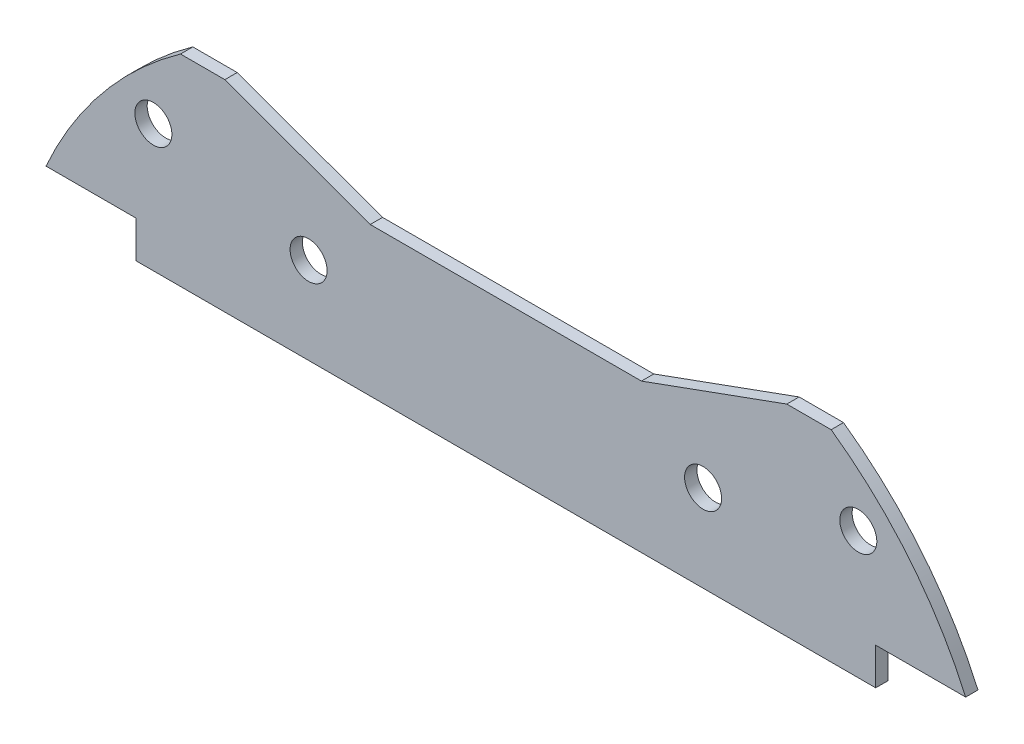
ISO-10303-21;
HEADER;
FILE_DESCRIPTION(('STEP AP214'),'2;1');
FILE_NAME('part.step','',(''),(''),'','','');
FILE_SCHEMA(('AUTOMOTIVE_DESIGN { 1 0 10303 214 1 1 1 1 }'));
ENDSEC;
DATA;
#1=APPLICATION_CONTEXT('core data for automotive mechanical design processes');
#2=APPLICATION_PROTOCOL_DEFINITION('international standard','automotive_design',2000,#1);
#3=PRODUCT_CONTEXT('',#1,'mechanical');
#4=PRODUCT('Part','Part','',(#3));
#5=PRODUCT_RELATED_PRODUCT_CATEGORY('part','',(#4));
#6=PRODUCT_DEFINITION_FORMATION('','',#4);
#7=PRODUCT_DEFINITION_CONTEXT('part definition',#1,'design');
#8=PRODUCT_DEFINITION('design','',#6,#7);
#9=PRODUCT_DEFINITION_SHAPE('','',#8);
#10=(LENGTH_UNIT() NAMED_UNIT(*) SI_UNIT(.MILLI.,.METRE.));
#11=(NAMED_UNIT(*) PLANE_ANGLE_UNIT() SI_UNIT($,.RADIAN.));
#12=(NAMED_UNIT(*) SI_UNIT($,.STERADIAN.) SOLID_ANGLE_UNIT());
#13=UNCERTAINTY_MEASURE_WITH_UNIT(LENGTH_MEASURE(1.E-05),#10,'distance_accuracy_value','');
#14=(GEOMETRIC_REPRESENTATION_CONTEXT(3) GLOBAL_UNCERTAINTY_ASSIGNED_CONTEXT((#13)) GLOBAL_UNIT_ASSIGNED_CONTEXT((#10,
#11,#12)) REPRESENTATION_CONTEXT('',''));
#15=CARTESIAN_POINT('',(0.,0.,0.));
#16=DIRECTION('',(0.,0.,1.));
#17=DIRECTION('',(1.,0.,0.));
#18=AXIS2_PLACEMENT_3D('',#15,#16,#17);
#19=CARTESIAN_POINT('',(0.,0.,0.));
#20=DIRECTION('',(0.,0.,1.));
#21=DIRECTION('',(1.,0.,0.));
#22=AXIS2_PLACEMENT_3D('',#19,#20,#21);
#23=PLANE('',#22);
#24=CARTESIAN_POINT('',(16.,20.5,0.));
#25=DIRECTION('',(0.,0.,-1.));
#26=DIRECTION('',(-1.,0.,0.));
#27=AXIS2_PLACEMENT_3D('',#24,#25,#26);
#28=CIRCLE('',#27,1.5);
#29=CARTESIAN_POINT('',(14.5,20.5,0.));
#30=VERTEX_POINT('',#29);
#31=EDGE_CURVE('E178',#30,#30,#28,.T.);
#32=ORIENTED_EDGE('',*,*,#31,.F.);
#33=EDGE_LOOP('',(#32));
#34=FACE_BOUND('',#33,.T.);
#35=CARTESIAN_POINT('',(-16.,20.5,0.));
#36=DIRECTION('',(0.,0.,-1.));
#37=DIRECTION('',(1.,0.,0.));
#38=AXIS2_PLACEMENT_3D('',#35,#36,#37);
#39=CIRCLE('',#38,1.5);
#40=CARTESIAN_POINT('',(-14.5,20.5,0.));
#41=VERTEX_POINT('',#40);
#42=EDGE_CURVE('E184',#41,#41,#39,.T.);
#43=ORIENTED_EDGE('',*,*,#42,.F.);
#44=EDGE_LOOP('',(#43));
#45=FACE_BOUND('',#44,.T.);
#46=CARTESIAN_POINT('',(-28.5900387108147,23.7802641955972,0.));
#47=DIRECTION('',(0.,0.,1.));
#48=DIRECTION('',(1.,0.,0.));
#49=AXIS2_PLACEMENT_3D('',#46,#47,#48);
#50=CIRCLE('',#49,1.5);
#51=CARTESIAN_POINT('',(-27.0900387108147,23.7802641955972,0.));
#52=VERTEX_POINT('',#51);
#53=EDGE_CURVE('E145',#52,#52,#50,.T.);
#54=ORIENTED_EDGE('',*,*,#53,.T.);
#55=EDGE_LOOP('',(#54));
#56=FACE_BOUND('',#55,.T.);
#57=CARTESIAN_POINT('',(28.5900387108147,23.7802641955972,0.));
#58=DIRECTION('',(0.,0.,1.));
#59=DIRECTION('',(-1.,0.,0.));
#60=AXIS2_PLACEMENT_3D('',#57,#58,#59);
#61=CIRCLE('',#60,1.5);
#62=CARTESIAN_POINT('',(27.0900387108147,23.7802641955972,0.));
#63=VERTEX_POINT('',#62);
#64=EDGE_CURVE('E196',#63,#63,#61,.T.);
#65=ORIENTED_EDGE('',*,*,#64,.T.);
#66=EDGE_LOOP('',(#65));
#67=FACE_BOUND('',#66,.T.);
#68=DIRECTION('',(0.,-1.,0.));
#69=VECTOR('',#68,1.);
#70=CARTESIAN_POINT('',(30.,16.4492983568228,0.));
#71=LINE('',#70,#69);
#72=CARTESIAN_POINT('',(30.,16.4492983568228,0.));
#73=VERTEX_POINT('',#72);
#74=CARTESIAN_POINT('',(30.,13.4492983568228,0.));
#75=VERTEX_POINT('',#74);
#76=EDGE_CURVE('E144',#73,#75,#71,.T.);
#77=ORIENTED_EDGE('',*,*,#76,.T.);
#78=DIRECTION('',(-1.,0.,0.));
#79=VECTOR('',#78,1.);
#80=CARTESIAN_POINT('',(-30.,13.4492983568228,0.));
#81=LINE('',#80,#79);
#82=CARTESIAN_POINT('',(-30.,13.4492983568228,0.));
#83=VERTEX_POINT('',#82);
#84=EDGE_CURVE('E129',#75,#83,#81,.T.);
#85=ORIENTED_EDGE('',*,*,#84,.T.);
#86=DIRECTION('',(0.,1.,0.));
#87=VECTOR('',#86,1.);
#88=CARTESIAN_POINT('',(-30.,16.4492983568228,0.));
#89=LINE('',#88,#87);
#90=CARTESIAN_POINT('',(-30.,16.4492983568228,0.));
#91=VERTEX_POINT('',#90);
#92=EDGE_CURVE('E141',#83,#91,#89,.T.);
#93=ORIENTED_EDGE('',*,*,#92,.T.);
#94=DIRECTION('',(-1.,0.,0.));
#95=VECTOR('',#94,1.);
#96=CARTESIAN_POINT('',(0.,16.4492983568228,0.));
#97=LINE('',#96,#95);
#98=CARTESIAN_POINT('',(-37.299711921146,16.4492983568228,0.));
#99=VERTEX_POINT('',#98);
#100=EDGE_CURVE('E164',#91,#99,#97,.T.);
#101=ORIENTED_EDGE('',*,*,#100,.T.);
#102=CARTESIAN_POINT('',(-7.61252759266184,3.28373542568487,0.));
#103=DIRECTION('',(0.,0.,1.));
#104=DIRECTION('',(-1.,0.,0.));
#105=AXIS2_PLACEMENT_3D('',#102,#103,#104);
#106=CIRCLE('',#105,32.4755440392789);
#107=CARTESIAN_POINT('',(-26.3900387108147,29.7802641955972,0.));
#108=VERTEX_POINT('',#107);
#109=EDGE_CURVE('E239',#108,#99,#106,.T.);
#110=ORIENTED_EDGE('',*,*,#109,.F.);
#111=DIRECTION('',(-1.,0.,0.));
#112=VECTOR('',#111,1.);
#113=CARTESIAN_POINT('',(-22.7900387108147,29.7802641955972,0.));
#114=LINE('',#113,#112);
#115=CARTESIAN_POINT('',(-22.7900387108147,29.7802641955972,0.));
#116=VERTEX_POINT('',#115);
#117=EDGE_CURVE('E234',#116,#108,#114,.T.);
#118=ORIENTED_EDGE('',*,*,#117,.F.);
#119=DIRECTION('',(-0.939973110395639,0.341248519019714,0.));
#120=VECTOR('',#119,1.);
#121=CARTESIAN_POINT('',(6.89853694287745,19.0021021805552,0.));
#122=LINE('',#121,#120);
#123=CARTESIAN_POINT('',(-11.,25.5,0.));
#124=VERTEX_POINT('',#123);
#125=EDGE_CURVE('E166',#124,#116,#122,.T.);
#126=ORIENTED_EDGE('',*,*,#125,.F.);
#127=DIRECTION('',(-1.,0.,0.));
#128=VECTOR('',#127,1.);
#129=CARTESIAN_POINT('',(0.,25.5,0.));
#130=LINE('',#129,#128);
#131=CARTESIAN_POINT('',(11.,25.5,0.));
#132=VERTEX_POINT('',#131);
#133=EDGE_CURVE('E171',#132,#124,#130,.T.);
#134=ORIENTED_EDGE('',*,*,#133,.F.);
#135=DIRECTION('',(0.939973110395639,0.341248519019713,0.));
#136=VECTOR('',#135,1.);
#137=CARTESIAN_POINT('',(-6.89853694287744,19.0021021805552,0.));
#138=LINE('',#137,#136);
#139=CARTESIAN_POINT('',(22.7900387108147,29.7802641955972,0.));
#140=VERTEX_POINT('',#139);
#141=EDGE_CURVE('E168',#132,#140,#138,.T.);
#142=ORIENTED_EDGE('',*,*,#141,.T.);
#143=DIRECTION('',(-1.,0.,0.));
#144=VECTOR('',#143,1.);
#145=CARTESIAN_POINT('',(22.7900387108147,29.7802641955972,0.));
#146=LINE('',#145,#144);
#147=CARTESIAN_POINT('',(26.3900387108147,29.7802641955972,0.));
#148=VERTEX_POINT('',#147);
#149=EDGE_CURVE('E227',#148,#140,#146,.T.);
#150=ORIENTED_EDGE('',*,*,#149,.F.);
#151=CARTESIAN_POINT('',(7.61252759266184,3.28373542568486,0.));
#152=DIRECTION('',(0.,0.,1.));
#153=DIRECTION('',(1.,0.,0.));
#154=AXIS2_PLACEMENT_3D('',#151,#152,#153);
#155=CIRCLE('',#154,32.4755440392789);
#156=CARTESIAN_POINT('',(37.299711921146,16.4492983568228,0.));
#157=VERTEX_POINT('',#156);
#158=EDGE_CURVE('E224',#157,#148,#155,.T.);
#159=ORIENTED_EDGE('',*,*,#158,.F.);
#160=DIRECTION('',(1.,0.,0.));
#161=VECTOR('',#160,1.);
#162=CARTESIAN_POINT('',(0.,16.4492983568228,0.));
#163=LINE('',#162,#161);
#164=EDGE_CURVE('E153',#73,#157,#163,.T.);
#165=ORIENTED_EDGE('',*,*,#164,.F.);
#166=EDGE_LOOP('',(#77,#85,#93,#101,#110,#118,#126,#134,#142,#150,#159,#165));
#167=FACE_BOUND('',#166,.T.);
#168=ADVANCED_FACE('F35',(#34,#45,#56,#67,#167),#23,.F.);
#169=CARTESIAN_POINT('',(6.89853694287745,19.0021021805552,3.));
#170=DIRECTION('',(-0.341248519019714,-0.939973110395639,0.));
#171=DIRECTION('',(0.939973110395639,-0.341248519019714,0.));
#172=AXIS2_PLACEMENT_3D('',#169,#170,#171);
#173=PLANE('',#172);
#174=DIRECTION('',(0.,0.,-1.));
#175=VECTOR('',#174,1.);
#176=CARTESIAN_POINT('',(-22.7900387108147,29.7802641955972,3.));
#177=LINE('',#176,#175);
#178=CARTESIAN_POINT('',(-22.7900387108147,29.7802641955972,1.));
#179=VERTEX_POINT('',#178);
#180=EDGE_CURVE('E11',#179,#116,#177,.T.);
#181=ORIENTED_EDGE('',*,*,#180,.F.);
#182=DIRECTION('',(-0.939973110395639,0.341248519019714,0.));
#183=VECTOR('',#182,1.);
#184=CARTESIAN_POINT('',(-22.7900387108147,29.7802641955972,1.));
#185=LINE('',#184,#183);
#186=CARTESIAN_POINT('',(-11.,25.5,1.));
#187=VERTEX_POINT('',#186);
#188=EDGE_CURVE('E218',#187,#179,#185,.T.);
#189=ORIENTED_EDGE('',*,*,#188,.F.);
#190=DIRECTION('',(0.,0.,-1.));
#191=VECTOR('',#190,1.);
#192=CARTESIAN_POINT('',(-11.,25.5,3.));
#193=LINE('',#192,#191);
#194=EDGE_CURVE('E60',#187,#124,#193,.T.);
#195=ORIENTED_EDGE('',*,*,#194,.T.);
#196=ORIENTED_EDGE('',*,*,#125,.T.);
#197=EDGE_LOOP('',(#181,#189,#195,#196));
#198=FACE_BOUND('',#197,.T.);
#199=ADVANCED_FACE('F37',(#198),#173,.F.);
#200=CARTESIAN_POINT('',(-6.89853694287744,19.0021021805552,3.));
#201=DIRECTION('',(-0.341248519019714,0.939973110395639,0.));
#202=DIRECTION('',(-0.939973110395639,-0.341248519019714,0.));
#203=AXIS2_PLACEMENT_3D('',#200,#201,#202);
#204=PLANE('',#203);
#205=DIRECTION('',(-0.939973110395639,-0.341248519019713,0.));
#206=VECTOR('',#205,1.);
#207=CARTESIAN_POINT('',(11.,25.5,1.));
#208=LINE('',#207,#206);
#209=CARTESIAN_POINT('',(22.7900387108147,29.7802641955972,1.));
#210=VERTEX_POINT('',#209);
#211=CARTESIAN_POINT('',(11.,25.5,1.));
#212=VERTEX_POINT('',#211);
#213=EDGE_CURVE('E214',#210,#212,#208,.T.);
#214=ORIENTED_EDGE('',*,*,#213,.F.);
#215=DIRECTION('',(0.,0.,-1.));
#216=VECTOR('',#215,1.);
#217=CARTESIAN_POINT('',(22.7900387108147,29.7802641955972,3.));
#218=LINE('',#217,#216);
#219=EDGE_CURVE('E44',#210,#140,#218,.T.);
#220=ORIENTED_EDGE('',*,*,#219,.T.);
#221=ORIENTED_EDGE('',*,*,#141,.F.);
#222=DIRECTION('',(0.,0.,-1.));
#223=VECTOR('',#222,1.);
#224=CARTESIAN_POINT('',(11.,25.5,3.));
#225=LINE('',#224,#223);
#226=EDGE_CURVE('E174',#212,#132,#225,.T.);
#227=ORIENTED_EDGE('',*,*,#226,.F.);
#228=EDGE_LOOP('',(#214,#220,#221,#227));
#229=FACE_BOUND('',#228,.T.);
#230=ADVANCED_FACE('F267',(#229),#204,.T.);
#231=CARTESIAN_POINT('',(0.,25.5,3.));
#232=DIRECTION('',(0.,-1.,0.));
#233=DIRECTION('',(1.,0.,0.));
#234=AXIS2_PLACEMENT_3D('',#231,#232,#233);
#235=PLANE('',#234);
#236=ORIENTED_EDGE('',*,*,#194,.F.);
#237=DIRECTION('',(-1.,0.,0.));
#238=VECTOR('',#237,1.);
#239=CARTESIAN_POINT('',(-11.,25.5,1.));
#240=LINE('',#239,#238);
#241=EDGE_CURVE('E216',#212,#187,#240,.T.);
#242=ORIENTED_EDGE('',*,*,#241,.F.);
#243=ORIENTED_EDGE('',*,*,#226,.T.);
#244=ORIENTED_EDGE('',*,*,#133,.T.);
#245=EDGE_LOOP('',(#236,#242,#243,#244));
#246=FACE_BOUND('',#245,.T.);
#247=ADVANCED_FACE('F260',(#246),#235,.F.);
#248=CARTESIAN_POINT('',(0.,16.4492983568228,0.));
#249=DIRECTION('',(0.,1.,0.));
#250=DIRECTION('',(0.,0.,1.));
#251=AXIS2_PLACEMENT_3D('',#248,#249,#250);
#252=PLANE('',#251);
#253=DIRECTION('',(0.,0.,1.));
#254=VECTOR('',#253,1.);
#255=CARTESIAN_POINT('',(-30.,16.4492983568228,0.));
#256=LINE('',#255,#254);
#257=CARTESIAN_POINT('',(-30.,16.4492983568228,1.));
#258=VERTEX_POINT('',#257);
#259=EDGE_CURVE('E150',#91,#258,#256,.T.);
#260=ORIENTED_EDGE('',*,*,#259,.T.);
#261=DIRECTION('',(1.,0.,0.));
#262=VECTOR('',#261,1.);
#263=CARTESIAN_POINT('',(-30.,16.4492983568228,1.));
#264=LINE('',#263,#262);
#265=CARTESIAN_POINT('',(-37.299711921146,16.4492983568228,1.));
#266=VERTEX_POINT('',#265);
#267=EDGE_CURVE('E201',#266,#258,#264,.T.);
#268=ORIENTED_EDGE('',*,*,#267,.F.);
#269=DIRECTION('',(0.,0.,1.));
#270=VECTOR('',#269,1.);
#271=CARTESIAN_POINT('',(-37.299711921146,16.4492983568228,0.));
#272=LINE('',#271,#270);
#273=EDGE_CURVE('E161',#99,#266,#272,.T.);
#274=ORIENTED_EDGE('',*,*,#273,.F.);
#275=ORIENTED_EDGE('',*,*,#100,.F.);
#276=EDGE_LOOP('',(#260,#268,#274,#275));
#277=FACE_BOUND('',#276,.T.);
#278=ADVANCED_FACE('F256',(#277),#252,.F.);
#279=CARTESIAN_POINT('',(0.,16.4492983568228,0.));
#280=DIRECTION('',(0.,-1.,0.));
#281=DIRECTION('',(0.,0.,-1.));
#282=AXIS2_PLACEMENT_3D('',#279,#280,#281);
#283=PLANE('',#282);
#284=DIRECTION('',(1.,0.,0.));
#285=VECTOR('',#284,1.);
#286=CARTESIAN_POINT('',(30.,16.4492983568228,1.));
#287=LINE('',#286,#285);
#288=CARTESIAN_POINT('',(30.,16.4492983568228,1.));
#289=VERTEX_POINT('',#288);
#290=CARTESIAN_POINT('',(37.299711921146,16.4492983568228,1.));
#291=VERTEX_POINT('',#290);
#292=EDGE_CURVE('E52',#289,#291,#287,.T.);
#293=ORIENTED_EDGE('',*,*,#292,.F.);
#294=DIRECTION('',(0.,0.,1.));
#295=VECTOR('',#294,1.);
#296=CARTESIAN_POINT('',(30.,16.4492983568228,0.));
#297=LINE('',#296,#295);
#298=EDGE_CURVE('E151',#73,#289,#297,.T.);
#299=ORIENTED_EDGE('',*,*,#298,.F.);
#300=ORIENTED_EDGE('',*,*,#164,.T.);
#301=DIRECTION('',(0.,0.,1.));
#302=VECTOR('',#301,1.);
#303=CARTESIAN_POINT('',(37.299711921146,16.4492983568228,0.));
#304=LINE('',#303,#302);
#305=EDGE_CURVE('E230',#157,#291,#304,.T.);
#306=ORIENTED_EDGE('',*,*,#305,.T.);
#307=EDGE_LOOP('',(#293,#299,#300,#306));
#308=FACE_BOUND('',#307,.T.);
#309=ADVANCED_FACE('F278',(#308),#283,.T.);
#310=CARTESIAN_POINT('',(-30.,16.4492983568228,0.));
#311=DIRECTION('',(1.,0.,0.));
#312=DIRECTION('',(0.,1.,0.));
#313=AXIS2_PLACEMENT_3D('',#310,#311,#312);
#314=PLANE('',#313);
#315=ORIENTED_EDGE('',*,*,#92,.F.);
#316=DIRECTION('',(0.,0.,1.));
#317=VECTOR('',#316,1.);
#318=CARTESIAN_POINT('',(-30.,13.4492983568228,0.));
#319=LINE('',#318,#317);
#320=CARTESIAN_POINT('',(-30.,13.4492983568228,1.));
#321=VERTEX_POINT('',#320);
#322=EDGE_CURVE('E126',#83,#321,#319,.T.);
#323=ORIENTED_EDGE('',*,*,#322,.T.);
#324=DIRECTION('',(0.,-1.,0.));
#325=VECTOR('',#324,1.);
#326=CARTESIAN_POINT('',(-30.,16.4492983568228,1.));
#327=LINE('',#326,#325);
#328=EDGE_CURVE('E204',#258,#321,#327,.T.);
#329=ORIENTED_EDGE('',*,*,#328,.F.);
#330=ORIENTED_EDGE('',*,*,#259,.F.);
#331=EDGE_LOOP('',(#315,#323,#329,#330));
#332=FACE_BOUND('',#331,.T.);
#333=ADVANCED_FACE('F148',(#332),#314,.F.);
#334=CARTESIAN_POINT('',(30.,16.4492983568228,0.));
#335=DIRECTION('',(-1.,0.,0.));
#336=DIRECTION('',(0.,-1.,0.));
#337=AXIS2_PLACEMENT_3D('',#334,#335,#336);
#338=PLANE('',#337);
#339=DIRECTION('',(0.,1.,0.));
#340=VECTOR('',#339,1.);
#341=CARTESIAN_POINT('',(30.,13.4492983568228,1.));
#342=LINE('',#341,#340);
#343=CARTESIAN_POINT('',(30.,13.4492983568228,1.));
#344=VERTEX_POINT('',#343);
#345=EDGE_CURVE('E207',#344,#289,#342,.T.);
#346=ORIENTED_EDGE('',*,*,#345,.F.);
#347=DIRECTION('',(0.,0.,1.));
#348=VECTOR('',#347,1.);
#349=CARTESIAN_POINT('',(30.,13.4492983568228,0.));
#350=LINE('',#349,#348);
#351=EDGE_CURVE('E137',#75,#344,#350,.T.);
#352=ORIENTED_EDGE('',*,*,#351,.F.);
#353=ORIENTED_EDGE('',*,*,#76,.F.);
#354=ORIENTED_EDGE('',*,*,#298,.T.);
#355=EDGE_LOOP('',(#346,#352,#353,#354));
#356=FACE_BOUND('',#355,.T.);
#357=ADVANCED_FACE('F281',(#356),#338,.F.);
#358=CARTESIAN_POINT('',(-7.61252759266184,3.28373542568487,0.));
#359=DIRECTION('',(0.,0.,1.));
#360=DIRECTION('',(1.,0.,0.));
#361=AXIS2_PLACEMENT_3D('',#358,#359,#360);
#362=CYLINDRICAL_SURFACE('',#361,32.4755440392789);
#363=CARTESIAN_POINT('',(-7.61252759266062,3.28373542568388,1.));
#364=DIRECTION('',(0.,0.,1.));
#365=DIRECTION('',(-1.,0.,0.));
#366=AXIS2_PLACEMENT_3D('',#363,#364,#365);
#367=CIRCLE('',#366,32.4755440392804);
#368=CARTESIAN_POINT('',(-26.3900387108147,29.7802641955972,1.));
#369=VERTEX_POINT('',#368);
#370=EDGE_CURVE('E222',#369,#266,#367,.T.);
#371=ORIENTED_EDGE('',*,*,#370,.F.);
#372=DIRECTION('',(0.,0.,1.));
#373=VECTOR('',#372,1.);
#374=CARTESIAN_POINT('',(-26.3900387108147,29.7802641955972,0.));
#375=LINE('',#374,#373);
#376=EDGE_CURVE('E158',#108,#369,#375,.T.);
#377=ORIENTED_EDGE('',*,*,#376,.F.);
#378=ORIENTED_EDGE('',*,*,#109,.T.);
#379=ORIENTED_EDGE('',*,*,#273,.T.);
#380=EDGE_LOOP('',(#371,#377,#378,#379));
#381=FACE_BOUND('',#380,.T.);
#382=ADVANCED_FACE('F252',(#381),#362,.T.);
#383=CARTESIAN_POINT('',(-22.7900387108147,29.7802641955972,0.));
#384=DIRECTION('',(0.,1.,0.));
#385=DIRECTION('',(0.,0.,1.));
#386=AXIS2_PLACEMENT_3D('',#383,#384,#385);
#387=PLANE('',#386);
#388=DIRECTION('',(-1.,0.,0.));
#389=VECTOR('',#388,1.);
#390=CARTESIAN_POINT('',(-26.3900387108147,29.7802641955972,1.));
#391=LINE('',#390,#389);
#392=EDGE_CURVE('E220',#179,#369,#391,.T.);
#393=ORIENTED_EDGE('',*,*,#392,.F.);
#394=ORIENTED_EDGE('',*,*,#180,.T.);
#395=ORIENTED_EDGE('',*,*,#117,.T.);
#396=ORIENTED_EDGE('',*,*,#376,.T.);
#397=EDGE_LOOP('',(#393,#394,#395,#396));
#398=FACE_BOUND('',#397,.T.);
#399=ADVANCED_FACE('F248',(#398),#387,.T.);
#400=CARTESIAN_POINT('',(22.7900387108147,29.7802641955972,0.));
#401=DIRECTION('',(0.,1.,0.));
#402=DIRECTION('',(0.,0.,1.));
#403=AXIS2_PLACEMENT_3D('',#400,#401,#402);
#404=PLANE('',#403);
#405=DIRECTION('',(-1.,0.,0.));
#406=VECTOR('',#405,1.);
#407=CARTESIAN_POINT('',(22.7900387108147,29.7802641955972,1.));
#408=LINE('',#407,#406);
#409=CARTESIAN_POINT('',(26.3900387108147,29.7802641955972,1.));
#410=VERTEX_POINT('',#409);
#411=EDGE_CURVE('E212',#410,#210,#408,.T.);
#412=ORIENTED_EDGE('',*,*,#411,.F.);
#413=DIRECTION('',(0.,0.,1.));
#414=VECTOR('',#413,1.);
#415=CARTESIAN_POINT('',(26.3900387108147,29.7802641955972,0.));
#416=LINE('',#415,#414);
#417=EDGE_CURVE('E231',#148,#410,#416,.T.);
#418=ORIENTED_EDGE('',*,*,#417,.F.);
#419=ORIENTED_EDGE('',*,*,#149,.T.);
#420=ORIENTED_EDGE('',*,*,#219,.F.);
#421=EDGE_LOOP('',(#412,#418,#419,#420));
#422=FACE_BOUND('',#421,.T.);
#423=ADVANCED_FACE('F271',(#422),#404,.T.);
#424=CARTESIAN_POINT('',(7.61252759266184,3.28373542568486,0.));
#425=DIRECTION('',(0.,0.,1.));
#426=DIRECTION('',(1.,0.,0.));
#427=AXIS2_PLACEMENT_3D('',#424,#425,#426);
#428=CYLINDRICAL_SURFACE('',#427,32.4755440392789);
#429=CARTESIAN_POINT('',(7.61252759266107,3.28373542568421,1.));
#430=DIRECTION('',(0.,0.,1.));
#431=DIRECTION('',(1.,0.,0.));
#432=AXIS2_PLACEMENT_3D('',#429,#430,#431);
#433=CIRCLE('',#432,32.4755440392799);
#434=EDGE_CURVE('E210',#291,#410,#433,.T.);
#435=ORIENTED_EDGE('',*,*,#434,.F.);
#436=ORIENTED_EDGE('',*,*,#305,.F.);
#437=ORIENTED_EDGE('',*,*,#158,.T.);
#438=ORIENTED_EDGE('',*,*,#417,.T.);
#439=EDGE_LOOP('',(#435,#436,#437,#438));
#440=FACE_BOUND('',#439,.T.);
#441=ADVANCED_FACE('F276',(#440),#428,.T.);
#442=CARTESIAN_POINT('',(-7.61252759266062,3.28373542568388,1.));
#443=DIRECTION('',(0.,0.,-1.));
#444=DIRECTION('',(-1.,0.,0.));
#445=AXIS2_PLACEMENT_3D('',#442,#443,#444);
#446=PLANE('',#445);
#447=CARTESIAN_POINT('',(16.,20.5,0.999999999999999));
#448=DIRECTION('',(0.,0.,-1.));
#449=DIRECTION('',(-1.,0.,0.));
#450=AXIS2_PLACEMENT_3D('',#447,#448,#449);
#451=CIRCLE('',#450,1.5);
#452=CARTESIAN_POINT('',(14.5,20.5,0.999999999999999));
#453=VERTEX_POINT('',#452);
#454=EDGE_CURVE('E39',#453,#453,#451,.T.);
#455=ORIENTED_EDGE('',*,*,#454,.T.);
#456=EDGE_LOOP('',(#455));
#457=FACE_BOUND('',#456,.T.);
#458=CARTESIAN_POINT('',(-16.,20.5,0.999999999999999));
#459=DIRECTION('',(0.,0.,-1.));
#460=DIRECTION('',(-1.,0.,0.));
#461=AXIS2_PLACEMENT_3D('',#458,#459,#460);
#462=CIRCLE('',#461,1.5);
#463=CARTESIAN_POINT('',(-17.5,20.5,0.999999999999999));
#464=VERTEX_POINT('',#463);
#465=EDGE_CURVE('E176',#464,#464,#462,.T.);
#466=ORIENTED_EDGE('',*,*,#465,.T.);
#467=EDGE_LOOP('',(#466));
#468=FACE_BOUND('',#467,.T.);
#469=CARTESIAN_POINT('',(-28.5900387108147,23.7802641955972,1.));
#470=DIRECTION('',(0.,0.,1.));
#471=DIRECTION('',(1.,0.,0.));
#472=AXIS2_PLACEMENT_3D('',#469,#470,#471);
#473=CIRCLE('',#472,1.5);
#474=CARTESIAN_POINT('',(-27.0900387108147,23.7802641955972,1.));
#475=VERTEX_POINT('',#474);
#476=EDGE_CURVE('E193',#475,#475,#473,.T.);
#477=ORIENTED_EDGE('',*,*,#476,.F.);
#478=EDGE_LOOP('',(#477));
#479=FACE_BOUND('',#478,.T.);
#480=CARTESIAN_POINT('',(28.5900387108147,23.7802641955972,1.));
#481=DIRECTION('',(0.,0.,1.));
#482=DIRECTION('',(-1.,0.,0.));
#483=AXIS2_PLACEMENT_3D('',#480,#481,#482);
#484=CIRCLE('',#483,1.5);
#485=CARTESIAN_POINT('',(27.0900387108147,23.7802641955972,1.));
#486=VERTEX_POINT('',#485);
#487=EDGE_CURVE('E182',#486,#486,#484,.T.);
#488=ORIENTED_EDGE('',*,*,#487,.F.);
#489=EDGE_LOOP('',(#488));
#490=FACE_BOUND('',#489,.T.);
#491=ORIENTED_EDGE('',*,*,#267,.T.);
#492=ORIENTED_EDGE('',*,*,#328,.T.);
#493=DIRECTION('',(1.,0.,0.));
#494=VECTOR('',#493,1.);
#495=CARTESIAN_POINT('',(-30.,13.4492983568228,1.));
#496=LINE('',#495,#494);
#497=EDGE_CURVE('E132',#321,#344,#496,.T.);
#498=ORIENTED_EDGE('',*,*,#497,.T.);
#499=ORIENTED_EDGE('',*,*,#345,.T.);
#500=ORIENTED_EDGE('',*,*,#292,.T.);
#501=ORIENTED_EDGE('',*,*,#434,.T.);
#502=ORIENTED_EDGE('',*,*,#411,.T.);
#503=ORIENTED_EDGE('',*,*,#213,.T.);
#504=ORIENTED_EDGE('',*,*,#241,.T.);
#505=ORIENTED_EDGE('',*,*,#188,.T.);
#506=ORIENTED_EDGE('',*,*,#392,.T.);
#507=ORIENTED_EDGE('',*,*,#370,.T.);
#508=EDGE_LOOP('',(#491,#492,#498,#499,#500,#501,#502,#503,#504,#505,#506,#507));
#509=FACE_BOUND('',#508,.T.);
#510=ADVANCED_FACE('F257',(#457,#468,#479,#490,#509),#446,.F.);
#511=CARTESIAN_POINT('',(-30.,13.4492983568228,0.));
#512=DIRECTION('',(0.,1.,0.));
#513=DIRECTION('',(0.,0.,1.));
#514=AXIS2_PLACEMENT_3D('',#511,#512,#513);
#515=PLANE('',#514);
#516=ORIENTED_EDGE('',*,*,#322,.F.);
#517=ORIENTED_EDGE('',*,*,#84,.F.);
#518=ORIENTED_EDGE('',*,*,#351,.T.);
#519=ORIENTED_EDGE('',*,*,#497,.F.);
#520=EDGE_LOOP('',(#516,#517,#518,#519));
#521=FACE_BOUND('',#520,.T.);
#522=ADVANCED_FACE('F128',(#521),#515,.F.);
#523=CARTESIAN_POINT('',(28.5900387108147,23.7802641955972,0.));
#524=DIRECTION('',(0.,0.,1.));
#525=DIRECTION('',(1.,0.,0.));
#526=AXIS2_PLACEMENT_3D('',#523,#524,#525);
#527=CYLINDRICAL_SURFACE('',#526,1.5);
#528=ORIENTED_EDGE('',*,*,#64,.F.);
#529=EDGE_LOOP('',(#528));
#530=FACE_BOUND('',#529,.T.);
#531=ORIENTED_EDGE('',*,*,#487,.T.);
#532=EDGE_LOOP('',(#531));
#533=FACE_BOUND('',#532,.T.);
#534=ADVANCED_FACE('F438',(#530,#533),#527,.F.);
#535=CARTESIAN_POINT('',(-28.5900387108147,23.7802641955972,0.));
#536=DIRECTION('',(0.,0.,1.));
#537=DIRECTION('',(1.,0.,0.));
#538=AXIS2_PLACEMENT_3D('',#535,#536,#537);
#539=CYLINDRICAL_SURFACE('',#538,1.5);
#540=ORIENTED_EDGE('',*,*,#53,.F.);
#541=EDGE_LOOP('',(#540));
#542=FACE_BOUND('',#541,.T.);
#543=ORIENTED_EDGE('',*,*,#476,.T.);
#544=EDGE_LOOP('',(#543));
#545=FACE_BOUND('',#544,.T.);
#546=ADVANCED_FACE('F446',(#542,#545),#539,.F.);
#547=CARTESIAN_POINT('',(-16.,20.5,10.));
#548=DIRECTION('',(0.,0.,-1.));
#549=DIRECTION('',(-1.,0.,0.));
#550=AXIS2_PLACEMENT_3D('',#547,#548,#549);
#551=CYLINDRICAL_SURFACE('',#550,1.5);
#552=ORIENTED_EDGE('',*,*,#42,.T.);
#553=EDGE_LOOP('',(#552));
#554=FACE_BOUND('',#553,.T.);
#555=ORIENTED_EDGE('',*,*,#465,.F.);
#556=EDGE_LOOP('',(#555));
#557=FACE_BOUND('',#556,.T.);
#558=ADVANCED_FACE('F454',(#554,#557),#551,.F.);
#559=CARTESIAN_POINT('',(16.,20.5,10.));
#560=DIRECTION('',(0.,0.,-1.));
#561=DIRECTION('',(-1.,0.,0.));
#562=AXIS2_PLACEMENT_3D('',#559,#560,#561);
#563=CYLINDRICAL_SURFACE('',#562,1.5);
#564=ORIENTED_EDGE('',*,*,#31,.T.);
#565=EDGE_LOOP('',(#564));
#566=FACE_BOUND('',#565,.T.);
#567=ORIENTED_EDGE('',*,*,#454,.F.);
#568=EDGE_LOOP('',(#567));
#569=FACE_BOUND('',#568,.T.);
#570=ADVANCED_FACE('F463',(#566,#569),#563,.F.);
#571=CLOSED_SHELL('',(#168,#199,#230,#247,#278,#309,#333,#357,#382,#399,#423,#441,#510,#522,
#534,#546,#558,#570));
#572=MANIFOLD_SOLID_BREP('B2',#571);
#573=ADVANCED_BREP_SHAPE_REPRESENTATION('',(#18,#572),#14);
#574=SHAPE_DEFINITION_REPRESENTATION(#9,#573);
ENDSEC;
END-ISO-10303-21;
